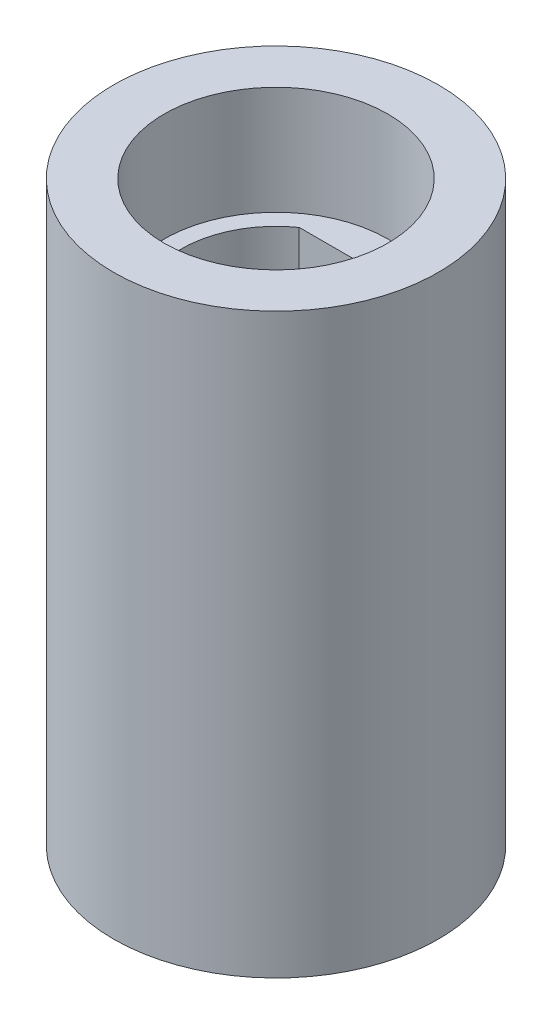
ISO-10303-21;
HEADER;
FILE_DESCRIPTION(('STEP AP214'),'2;1');
FILE_NAME('part.step','',(''),(''),'','','');
FILE_SCHEMA(('AUTOMOTIVE_DESIGN { 1 0 10303 214 1 1 1 1 }'));
ENDSEC;
DATA;
#1=APPLICATION_CONTEXT('core data for automotive mechanical design processes');
#2=APPLICATION_PROTOCOL_DEFINITION('international standard','automotive_design',2000,#1);
#3=PRODUCT_CONTEXT('',#1,'mechanical');
#4=PRODUCT('Part','Part','',(#3));
#5=PRODUCT_RELATED_PRODUCT_CATEGORY('part','',(#4));
#6=PRODUCT_DEFINITION_FORMATION('','',#4);
#7=PRODUCT_DEFINITION_CONTEXT('part definition',#1,'design');
#8=PRODUCT_DEFINITION('design','',#6,#7);
#9=PRODUCT_DEFINITION_SHAPE('','',#8);
#10=(LENGTH_UNIT() NAMED_UNIT(*) SI_UNIT(.MILLI.,.METRE.));
#11=(NAMED_UNIT(*) PLANE_ANGLE_UNIT() SI_UNIT($,.RADIAN.));
#12=(NAMED_UNIT(*) SI_UNIT($,.STERADIAN.) SOLID_ANGLE_UNIT());
#13=UNCERTAINTY_MEASURE_WITH_UNIT(LENGTH_MEASURE(1.E-05),#10,'distance_accuracy_value','');
#14=(GEOMETRIC_REPRESENTATION_CONTEXT(3) GLOBAL_UNCERTAINTY_ASSIGNED_CONTEXT((#13)) GLOBAL_UNIT_ASSIGNED_CONTEXT((#10,
#11,#12)) REPRESENTATION_CONTEXT('',''));
#15=CARTESIAN_POINT('',(0.,0.,0.));
#16=DIRECTION('',(0.,0.,1.));
#17=DIRECTION('',(1.,0.,0.));
#18=AXIS2_PLACEMENT_3D('',#15,#16,#17);
#19=CARTESIAN_POINT('',(0.,16.,0.));
#20=DIRECTION('',(0.,-1.,0.));
#21=DIRECTION('',(0.,0.,-1.));
#22=AXIS2_PLACEMENT_3D('',#19,#20,#21);
#23=CYLINDRICAL_SURFACE('',#22,2.625);
#24=DIRECTION('',(0.,-1.,0.));
#25=VECTOR('',#24,1.);
#26=CARTESIAN_POINT('',(-1.5060295481829,16.,-2.15));
#27=LINE('',#26,#25);
#28=CARTESIAN_POINT('',(-1.5060295481829,13.,-2.15));
#29=VERTEX_POINT('',#28);
#30=CARTESIAN_POINT('',(-1.5060295481829,0.,-2.15));
#31=VERTEX_POINT('',#30);
#32=EDGE_CURVE('E62',#29,#31,#27,.T.);
#33=ORIENTED_EDGE('',*,*,#32,.F.);
#34=CARTESIAN_POINT('',(0.,13.,0.));
#35=DIRECTION('',(0.,1.,0.));
#36=DIRECTION('',(0.,0.,1.));
#37=AXIS2_PLACEMENT_3D('',#34,#35,#36);
#38=CIRCLE('',#37,2.625);
#39=CARTESIAN_POINT('',(1.5060295481829,13.,-2.15));
#40=VERTEX_POINT('',#39);
#41=EDGE_CURVE('E54',#29,#40,#38,.T.);
#42=ORIENTED_EDGE('',*,*,#41,.T.);
#43=DIRECTION('',(0.,-1.,0.));
#44=VECTOR('',#43,1.);
#45=CARTESIAN_POINT('',(1.5060295481829,16.,-2.15));
#46=LINE('',#45,#44);
#47=CARTESIAN_POINT('',(1.5060295481829,0.,-2.15));
#48=VERTEX_POINT('',#47);
#49=EDGE_CURVE('E72',#40,#48,#46,.T.);
#50=ORIENTED_EDGE('',*,*,#49,.T.);
#51=CARTESIAN_POINT('',(0.,0.,0.));
#52=DIRECTION('',(0.,1.,0.));
#53=DIRECTION('',(0.,0.,1.));
#54=AXIS2_PLACEMENT_3D('',#51,#52,#53);
#55=CIRCLE('',#54,2.625);
#56=EDGE_CURVE('E75',#31,#48,#55,.T.);
#57=ORIENTED_EDGE('',*,*,#56,.F.);
#58=EDGE_LOOP('',(#33,#42,#50,#57));
#59=FACE_BOUND('',#58,.T.);
#60=ADVANCED_FACE('F41',(#59),#23,.F.);
#61=CARTESIAN_POINT('',(1.5060295481829,16.,-2.15));
#62=DIRECTION('',(0.,0.,1.));
#63=DIRECTION('',(1.,0.,0.));
#64=AXIS2_PLACEMENT_3D('',#61,#62,#63);
#65=PLANE('',#64);
#66=ORIENTED_EDGE('',*,*,#49,.F.);
#67=DIRECTION('',(-1.,0.,0.));
#68=VECTOR('',#67,1.);
#69=CARTESIAN_POINT('',(1.5060295481829,13.,-2.15));
#70=LINE('',#69,#68);
#71=EDGE_CURVE('E11',#40,#29,#70,.T.);
#72=ORIENTED_EDGE('',*,*,#71,.T.);
#73=ORIENTED_EDGE('',*,*,#32,.T.);
#74=DIRECTION('',(-1.,0.,0.));
#75=VECTOR('',#74,1.);
#76=CARTESIAN_POINT('',(1.5060295481829,0.,-2.15));
#77=LINE('',#76,#75);
#78=EDGE_CURVE('E80',#48,#31,#77,.T.);
#79=ORIENTED_EDGE('',*,*,#78,.F.);
#80=EDGE_LOOP('',(#66,#72,#73,#79));
#81=FACE_BOUND('',#80,.T.);
#82=ADVANCED_FACE('F73',(#81),#65,.T.);
#83=CARTESIAN_POINT('',(0.,16.,0.));
#84=DIRECTION('',(0.,1.,0.));
#85=DIRECTION('',(0.,0.,1.));
#86=AXIS2_PLACEMENT_3D('',#83,#84,#85);
#87=PLANE('',#86);
#88=CARTESIAN_POINT('',(0.,16.,0.));
#89=DIRECTION('',(0.,1.,0.));
#90=DIRECTION('',(0.,0.,1.));
#91=AXIS2_PLACEMENT_3D('',#88,#89,#90);
#92=CIRCLE('',#91,3.1);
#93=CARTESIAN_POINT('',(0.,16.,3.1));
#94=VERTEX_POINT('',#93);
#95=EDGE_CURVE('E99',#94,#94,#92,.T.);
#96=ORIENTED_EDGE('',*,*,#95,.F.);
#97=EDGE_LOOP('',(#96));
#98=FACE_BOUND('',#97,.T.);
#99=CARTESIAN_POINT('',(0.,16.,0.));
#100=DIRECTION('',(0.,1.,0.));
#101=DIRECTION('',(0.,0.,1.));
#102=AXIS2_PLACEMENT_3D('',#99,#100,#101);
#103=CIRCLE('',#102,4.5);
#104=CARTESIAN_POINT('',(0.,16.,4.5));
#105=VERTEX_POINT('',#104);
#106=EDGE_CURVE('E47',#105,#105,#103,.T.);
#107=ORIENTED_EDGE('',*,*,#106,.T.);
#108=EDGE_LOOP('',(#107));
#109=FACE_BOUND('',#108,.T.);
#110=ADVANCED_FACE('F86',(#98,#109),#87,.T.);
#111=CARTESIAN_POINT('',(0.,0.,0.));
#112=DIRECTION('',(0.,1.,0.));
#113=DIRECTION('',(0.,0.,1.));
#114=AXIS2_PLACEMENT_3D('',#111,#112,#113);
#115=PLANE('',#114);
#116=CARTESIAN_POINT('',(0.,0.,0.));
#117=DIRECTION('',(0.,1.,0.));
#118=DIRECTION('',(0.,0.,1.));
#119=AXIS2_PLACEMENT_3D('',#116,#117,#118);
#120=CIRCLE('',#119,4.5);
#121=CARTESIAN_POINT('',(0.,0.,4.5));
#122=VERTEX_POINT('',#121);
#123=EDGE_CURVE('E76',#122,#122,#120,.T.);
#124=ORIENTED_EDGE('',*,*,#123,.F.);
#125=EDGE_LOOP('',(#124));
#126=FACE_BOUND('',#125,.T.);
#127=ORIENTED_EDGE('',*,*,#56,.T.);
#128=ORIENTED_EDGE('',*,*,#78,.T.);
#129=EDGE_LOOP('',(#127,#128));
#130=FACE_BOUND('',#129,.T.);
#131=ADVANCED_FACE('F91',(#126,#130),#115,.F.);
#132=CARTESIAN_POINT('',(0.,16.,0.));
#133=DIRECTION('',(0.,-1.,0.));
#134=DIRECTION('',(0.,0.,-1.));
#135=AXIS2_PLACEMENT_3D('',#132,#133,#134);
#136=CYLINDRICAL_SURFACE('',#135,4.5);
#137=ORIENTED_EDGE('',*,*,#106,.F.);
#138=EDGE_LOOP('',(#137));
#139=FACE_BOUND('',#138,.T.);
#140=ORIENTED_EDGE('',*,*,#123,.T.);
#141=EDGE_LOOP('',(#140));
#142=FACE_BOUND('',#141,.T.);
#143=ADVANCED_FACE('F43',(#139,#142),#136,.T.);
#144=CARTESIAN_POINT('',(0.,13.,0.));
#145=DIRECTION('',(0.,1.,0.));
#146=DIRECTION('',(0.,0.,1.));
#147=AXIS2_PLACEMENT_3D('',#144,#145,#146);
#148=CYLINDRICAL_SURFACE('',#147,3.1);
#149=CARTESIAN_POINT('',(0.,13.,0.));
#150=DIRECTION('',(0.,1.,0.));
#151=DIRECTION('',(0.,0.,1.));
#152=AXIS2_PLACEMENT_3D('',#149,#150,#151);
#153=CIRCLE('',#152,3.1);
#154=CARTESIAN_POINT('',(0.,13.,3.1));
#155=VERTEX_POINT('',#154);
#156=EDGE_CURVE('E71',#155,#155,#153,.T.);
#157=ORIENTED_EDGE('',*,*,#156,.F.);
#158=EDGE_LOOP('',(#157));
#159=FACE_BOUND('',#158,.T.);
#160=ORIENTED_EDGE('',*,*,#95,.T.);
#161=EDGE_LOOP('',(#160));
#162=FACE_BOUND('',#161,.T.);
#163=ADVANCED_FACE('F95',(#159,#162),#148,.F.);
#164=CARTESIAN_POINT('',(0.,13.,0.));
#165=DIRECTION('',(0.,1.,0.));
#166=DIRECTION('',(0.,0.,1.));
#167=AXIS2_PLACEMENT_3D('',#164,#165,#166);
#168=PLANE('',#167);
#169=ORIENTED_EDGE('',*,*,#71,.F.);
#170=ORIENTED_EDGE('',*,*,#41,.F.);
#171=EDGE_LOOP('',(#169,#170));
#172=FACE_BOUND('',#171,.T.);
#173=ORIENTED_EDGE('',*,*,#156,.T.);
#174=EDGE_LOOP('',(#173));
#175=FACE_BOUND('',#174,.T.);
#176=ADVANCED_FACE('F70',(#172,#175),#168,.T.);
#177=CLOSED_SHELL('',(#60,#82,#110,#131,#143,#163,#176));
#178=MANIFOLD_SOLID_BREP('B2',#177);
#179=ADVANCED_BREP_SHAPE_REPRESENTATION('',(#18,#178),#14);
#180=SHAPE_DEFINITION_REPRESENTATION(#9,#179);
ENDSEC;
END-ISO-10303-21;
